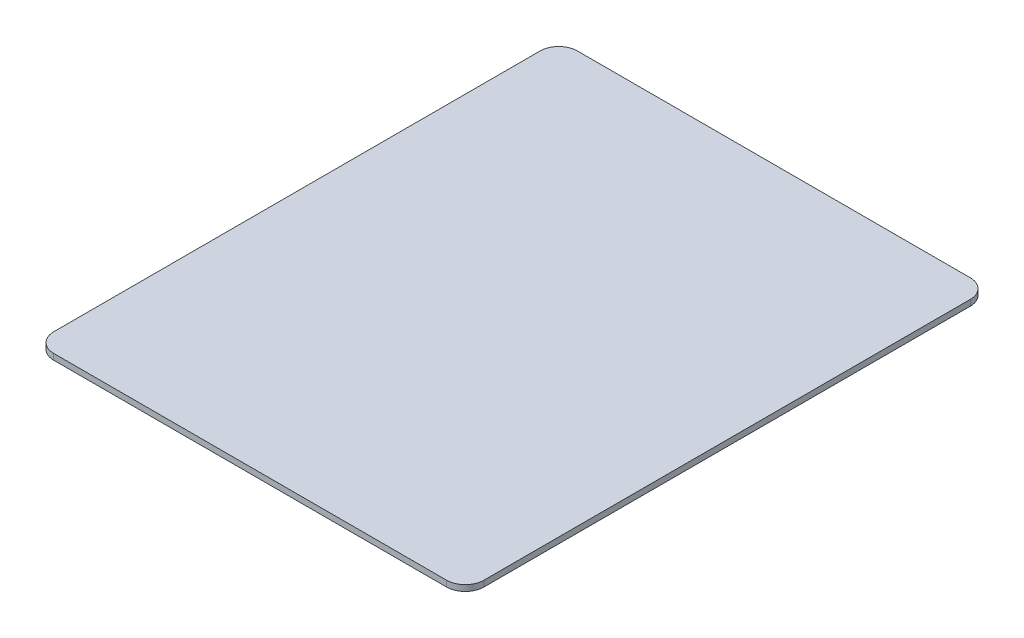
ISO-10303-21;
HEADER;
FILE_DESCRIPTION(('STEP AP214'),'2;1');
FILE_NAME('part.step','',(''),(''),'','','');
FILE_SCHEMA(('AUTOMOTIVE_DESIGN { 1 0 10303 214 1 1 1 1 }'));
ENDSEC;
DATA;
#1=APPLICATION_CONTEXT('core data for automotive mechanical design processes');
#2=APPLICATION_PROTOCOL_DEFINITION('international standard','automotive_design',2000,#1);
#3=PRODUCT_CONTEXT('',#1,'mechanical');
#4=PRODUCT('Part','Part','',(#3));
#5=PRODUCT_RELATED_PRODUCT_CATEGORY('part','',(#4));
#6=PRODUCT_DEFINITION_FORMATION('','',#4);
#7=PRODUCT_DEFINITION_CONTEXT('part definition',#1,'design');
#8=PRODUCT_DEFINITION('design','',#6,#7);
#9=PRODUCT_DEFINITION_SHAPE('','',#8);
#10=(LENGTH_UNIT() NAMED_UNIT(*) SI_UNIT(.MILLI.,.METRE.));
#11=(NAMED_UNIT(*) PLANE_ANGLE_UNIT() SI_UNIT($,.RADIAN.));
#12=(NAMED_UNIT(*) SI_UNIT($,.STERADIAN.) SOLID_ANGLE_UNIT());
#13=UNCERTAINTY_MEASURE_WITH_UNIT(LENGTH_MEASURE(1.E-05),#10,'distance_accuracy_value','');
#14=(GEOMETRIC_REPRESENTATION_CONTEXT(3) GLOBAL_UNCERTAINTY_ASSIGNED_CONTEXT((#13)) GLOBAL_UNIT_ASSIGNED_CONTEXT((#10,
#11,#12)) REPRESENTATION_CONTEXT('',''));
#15=CARTESIAN_POINT('',(0.,0.,0.));
#16=DIRECTION('',(0.,0.,1.));
#17=DIRECTION('',(1.,0.,0.));
#18=AXIS2_PLACEMENT_3D('',#15,#16,#17);
#19=CARTESIAN_POINT('',(115.,3.175,140.));
#20=DIRECTION('',(-1.,0.,0.));
#21=DIRECTION('',(0.,0.,1.));
#22=AXIS2_PLACEMENT_3D('',#19,#20,#21);
#23=PLANE('',#22);
#24=DIRECTION('',(0.,0.,-1.));
#25=VECTOR('',#24,1.);
#26=CARTESIAN_POINT('',(115.,0.,140.));
#27=LINE('',#26,#25);
#28=CARTESIAN_POINT('',(115.,0.,130.));
#29=VERTEX_POINT('',#28);
#30=CARTESIAN_POINT('',(115.,0.,-130.));
#31=VERTEX_POINT('',#30);
#32=EDGE_CURVE('E140',#29,#31,#27,.T.);
#33=ORIENTED_EDGE('',*,*,#32,.T.);
#34=DIRECTION('',(0.,-1.,0.));
#35=VECTOR('',#34,1.);
#36=CARTESIAN_POINT('',(115.,3.175,-130.));
#37=LINE('',#36,#35);
#38=CARTESIAN_POINT('',(115.,3.175,-130.));
#39=VERTEX_POINT('',#38);
#40=EDGE_CURVE('E174',#31,#39,#37,.F.);
#41=ORIENTED_EDGE('',*,*,#40,.T.);
#42=DIRECTION('',(0.,0.,-1.));
#43=VECTOR('',#42,1.);
#44=CARTESIAN_POINT('',(115.,3.175,140.));
#45=LINE('',#44,#43);
#46=CARTESIAN_POINT('',(115.,3.175,130.));
#47=VERTEX_POINT('',#46);
#48=EDGE_CURVE('E138',#47,#39,#45,.T.);
#49=ORIENTED_EDGE('',*,*,#48,.F.);
#50=DIRECTION('',(0.,-1.,0.));
#51=VECTOR('',#50,1.);
#52=CARTESIAN_POINT('',(115.,3.175,130.));
#53=LINE('',#52,#51);
#54=EDGE_CURVE('E170',#47,#29,#53,.T.);
#55=ORIENTED_EDGE('',*,*,#54,.T.);
#56=EDGE_LOOP('',(#33,#41,#49,#55));
#57=FACE_BOUND('',#56,.T.);
#58=ADVANCED_FACE('F39',(#57),#23,.F.);
#59=CARTESIAN_POINT('',(-115.,3.175,-140.));
#60=DIRECTION('',(0.,0.,1.));
#61=DIRECTION('',(1.,0.,0.));
#62=AXIS2_PLACEMENT_3D('',#59,#60,#61);
#63=PLANE('',#62);
#64=DIRECTION('',(-1.,0.,0.));
#65=VECTOR('',#64,1.);
#66=CARTESIAN_POINT('',(-115.,0.,-140.));
#67=LINE('',#66,#65);
#68=CARTESIAN_POINT('',(105.,0.,-140.));
#69=VERTEX_POINT('',#68);
#70=CARTESIAN_POINT('',(-105.,0.,-140.));
#71=VERTEX_POINT('',#70);
#72=EDGE_CURVE('E134',#69,#71,#67,.T.);
#73=ORIENTED_EDGE('',*,*,#72,.T.);
#74=DIRECTION('',(0.,-1.,0.));
#75=VECTOR('',#74,1.);
#76=CARTESIAN_POINT('',(-105.,3.175,-140.));
#77=LINE('',#76,#75);
#78=CARTESIAN_POINT('',(-105.,3.175,-140.));
#79=VERTEX_POINT('',#78);
#80=EDGE_CURVE('E110',#71,#79,#77,.F.);
#81=ORIENTED_EDGE('',*,*,#80,.T.);
#82=DIRECTION('',(-1.,0.,0.));
#83=VECTOR('',#82,1.);
#84=CARTESIAN_POINT('',(-115.,3.175,-140.));
#85=LINE('',#84,#83);
#86=CARTESIAN_POINT('',(105.,3.175,-140.));
#87=VERTEX_POINT('',#86);
#88=EDGE_CURVE('E193',#87,#79,#85,.T.);
#89=ORIENTED_EDGE('',*,*,#88,.F.);
#90=DIRECTION('',(0.,-1.,0.));
#91=VECTOR('',#90,1.);
#92=CARTESIAN_POINT('',(105.,3.175,-140.));
#93=LINE('',#92,#91);
#94=EDGE_CURVE('E116',#87,#69,#93,.T.);
#95=ORIENTED_EDGE('',*,*,#94,.T.);
#96=EDGE_LOOP('',(#73,#81,#89,#95));
#97=FACE_BOUND('',#96,.T.);
#98=ADVANCED_FACE('F214',(#97),#63,.F.);
#99=CARTESIAN_POINT('',(-115.,3.175,140.));
#100=DIRECTION('',(1.,0.,0.));
#101=DIRECTION('',(0.,0.,-1.));
#102=AXIS2_PLACEMENT_3D('',#99,#100,#101);
#103=PLANE('',#102);
#104=DIRECTION('',(0.,0.,1.));
#105=VECTOR('',#104,1.);
#106=CARTESIAN_POINT('',(-115.,3.175,140.));
#107=LINE('',#106,#105);
#108=CARTESIAN_POINT('',(-115.,3.175,-130.));
#109=VERTEX_POINT('',#108);
#110=CARTESIAN_POINT('',(-115.,3.175,130.));
#111=VERTEX_POINT('',#110);
#112=EDGE_CURVE('E125',#109,#111,#107,.T.);
#113=ORIENTED_EDGE('',*,*,#112,.F.);
#114=DIRECTION('',(0.,-1.,0.));
#115=VECTOR('',#114,1.);
#116=CARTESIAN_POINT('',(-115.,3.175,-130.));
#117=LINE('',#116,#115);
#118=CARTESIAN_POINT('',(-115.,0.,-130.));
#119=VERTEX_POINT('',#118);
#120=EDGE_CURVE('E109',#109,#119,#117,.T.);
#121=ORIENTED_EDGE('',*,*,#120,.T.);
#122=DIRECTION('',(0.,0.,1.));
#123=VECTOR('',#122,1.);
#124=CARTESIAN_POINT('',(-115.,0.,140.));
#125=LINE('',#124,#123);
#126=CARTESIAN_POINT('',(-115.,0.,130.));
#127=VERTEX_POINT('',#126);
#128=EDGE_CURVE('E123',#119,#127,#125,.T.);
#129=ORIENTED_EDGE('',*,*,#128,.T.);
#130=DIRECTION('',(0.,-1.,0.));
#131=VECTOR('',#130,1.);
#132=CARTESIAN_POINT('',(-115.,3.175,130.));
#133=LINE('',#132,#131);
#134=EDGE_CURVE('E128',#127,#111,#133,.F.);
#135=ORIENTED_EDGE('',*,*,#134,.T.);
#136=EDGE_LOOP('',(#113,#121,#129,#135));
#137=FACE_BOUND('',#136,.T.);
#138=ADVANCED_FACE('F122',(#137),#103,.F.);
#139=CARTESIAN_POINT('',(-115.,3.175,140.));
#140=DIRECTION('',(0.,0.,-1.));
#141=DIRECTION('',(-1.,0.,0.));
#142=AXIS2_PLACEMENT_3D('',#139,#140,#141);
#143=PLANE('',#142);
#144=DIRECTION('',(1.,0.,0.));
#145=VECTOR('',#144,1.);
#146=CARTESIAN_POINT('',(-115.,0.,140.));
#147=LINE('',#146,#145);
#148=CARTESIAN_POINT('',(-105.,0.,140.));
#149=VERTEX_POINT('',#148);
#150=CARTESIAN_POINT('',(105.,0.,140.));
#151=VERTEX_POINT('',#150);
#152=EDGE_CURVE('E133',#149,#151,#147,.T.);
#153=ORIENTED_EDGE('',*,*,#152,.T.);
#154=DIRECTION('',(0.,-1.,0.));
#155=VECTOR('',#154,1.);
#156=CARTESIAN_POINT('',(105.,3.175,140.));
#157=LINE('',#156,#155);
#158=CARTESIAN_POINT('',(105.,3.175,140.));
#159=VERTEX_POINT('',#158);
#160=EDGE_CURVE('E11',#151,#159,#157,.F.);
#161=ORIENTED_EDGE('',*,*,#160,.T.);
#162=DIRECTION('',(1.,0.,0.));
#163=VECTOR('',#162,1.);
#164=CARTESIAN_POINT('',(-115.,3.175,140.));
#165=LINE('',#164,#163);
#166=CARTESIAN_POINT('',(-105.,3.175,140.));
#167=VERTEX_POINT('',#166);
#168=EDGE_CURVE('E145',#167,#159,#165,.T.);
#169=ORIENTED_EDGE('',*,*,#168,.F.);
#170=DIRECTION('',(0.,-1.,0.));
#171=VECTOR('',#170,1.);
#172=CARTESIAN_POINT('',(-105.,3.175,140.));
#173=LINE('',#172,#171);
#174=EDGE_CURVE('E48',#167,#149,#173,.T.);
#175=ORIENTED_EDGE('',*,*,#174,.T.);
#176=EDGE_LOOP('',(#153,#161,#169,#175));
#177=FACE_BOUND('',#176,.T.);
#178=ADVANCED_FACE('F179',(#177),#143,.F.);
#179=CARTESIAN_POINT('',(0.,3.175,0.));
#180=DIRECTION('',(0.,-1.,0.));
#181=DIRECTION('',(0.,0.,-1.));
#182=AXIS2_PLACEMENT_3D('',#179,#180,#181);
#183=PLANE('',#182);
#184=ORIENTED_EDGE('',*,*,#88,.T.);
#185=CARTESIAN_POINT('',(-105.,3.175,-130.));
#186=DIRECTION('',(0.,-1.,0.));
#187=DIRECTION('',(0.,0.,-1.));
#188=AXIS2_PLACEMENT_3D('',#185,#186,#187);
#189=CIRCLE('',#188,10.);
#190=EDGE_CURVE('E167',#79,#109,#189,.F.);
#191=ORIENTED_EDGE('',*,*,#190,.T.);
#192=ORIENTED_EDGE('',*,*,#112,.T.);
#193=CARTESIAN_POINT('',(-105.,3.175,130.));
#194=DIRECTION('',(0.,-1.,0.));
#195=DIRECTION('',(0.,0.,-1.));
#196=AXIS2_PLACEMENT_3D('',#193,#194,#195);
#197=CIRCLE('',#196,10.);
#198=EDGE_CURVE('E60',#111,#167,#197,.F.);
#199=ORIENTED_EDGE('',*,*,#198,.T.);
#200=ORIENTED_EDGE('',*,*,#168,.T.);
#201=CARTESIAN_POINT('',(105.,3.175,130.));
#202=DIRECTION('',(0.,-1.,0.));
#203=DIRECTION('',(0.,0.,-1.));
#204=AXIS2_PLACEMENT_3D('',#201,#202,#203);
#205=CIRCLE('',#204,10.);
#206=EDGE_CURVE('E161',#159,#47,#205,.F.);
#207=ORIENTED_EDGE('',*,*,#206,.T.);
#208=ORIENTED_EDGE('',*,*,#48,.T.);
#209=CARTESIAN_POINT('',(105.,3.175,-130.));
#210=DIRECTION('',(0.,-1.,0.));
#211=DIRECTION('',(0.,0.,-1.));
#212=AXIS2_PLACEMENT_3D('',#209,#210,#211);
#213=CIRCLE('',#212,10.);
#214=EDGE_CURVE('E164',#39,#87,#213,.F.);
#215=ORIENTED_EDGE('',*,*,#214,.T.);
#216=EDGE_LOOP('',(#184,#191,#192,#199,#200,#207,#208,#215));
#217=FACE_BOUND('',#216,.T.);
#218=ADVANCED_FACE('F203',(#217),#183,.F.);
#219=CARTESIAN_POINT('',(0.,0.,0.));
#220=DIRECTION('',(0.,-1.,0.));
#221=DIRECTION('',(0.,0.,-1.));
#222=AXIS2_PLACEMENT_3D('',#219,#220,#221);
#223=PLANE('',#222);
#224=ORIENTED_EDGE('',*,*,#128,.F.);
#225=CARTESIAN_POINT('',(-105.,0.,-130.));
#226=DIRECTION('',(0.,-1.,0.));
#227=DIRECTION('',(0.,0.,-1.));
#228=AXIS2_PLACEMENT_3D('',#225,#226,#227);
#229=CIRCLE('',#228,10.);
#230=EDGE_CURVE('E105',#119,#71,#229,.T.);
#231=ORIENTED_EDGE('',*,*,#230,.T.);
#232=ORIENTED_EDGE('',*,*,#72,.F.);
#233=CARTESIAN_POINT('',(105.,0.,-130.));
#234=DIRECTION('',(0.,-1.,0.));
#235=DIRECTION('',(0.,0.,-1.));
#236=AXIS2_PLACEMENT_3D('',#233,#234,#235);
#237=CIRCLE('',#236,10.);
#238=EDGE_CURVE('E117',#69,#31,#237,.T.);
#239=ORIENTED_EDGE('',*,*,#238,.T.);
#240=ORIENTED_EDGE('',*,*,#32,.F.);
#241=CARTESIAN_POINT('',(105.,0.,130.));
#242=DIRECTION('',(0.,-1.,0.));
#243=DIRECTION('',(0.,0.,-1.));
#244=AXIS2_PLACEMENT_3D('',#241,#242,#243);
#245=CIRCLE('',#244,10.);
#246=EDGE_CURVE('E149',#29,#151,#245,.T.);
#247=ORIENTED_EDGE('',*,*,#246,.T.);
#248=ORIENTED_EDGE('',*,*,#152,.F.);
#249=CARTESIAN_POINT('',(-105.,0.,130.));
#250=DIRECTION('',(0.,-1.,0.));
#251=DIRECTION('',(0.,0.,-1.));
#252=AXIS2_PLACEMENT_3D('',#249,#250,#251);
#253=CIRCLE('',#252,10.);
#254=EDGE_CURVE('E127',#149,#127,#253,.T.);
#255=ORIENTED_EDGE('',*,*,#254,.T.);
#256=EDGE_LOOP('',(#224,#231,#232,#239,#240,#247,#248,#255));
#257=FACE_BOUND('',#256,.T.);
#258=ADVANCED_FACE('F130',(#257),#223,.T.);
#259=CARTESIAN_POINT('',(-105.,3.175,-130.));
#260=DIRECTION('',(0.,-1.,0.));
#261=DIRECTION('',(0.,0.,-1.));
#262=AXIS2_PLACEMENT_3D('',#259,#260,#261);
#263=CYLINDRICAL_SURFACE('',#262,10.);
#264=ORIENTED_EDGE('',*,*,#190,.F.);
#265=ORIENTED_EDGE('',*,*,#80,.F.);
#266=ORIENTED_EDGE('',*,*,#230,.F.);
#267=ORIENTED_EDGE('',*,*,#120,.F.);
#268=EDGE_LOOP('',(#264,#265,#266,#267));
#269=FACE_BOUND('',#268,.T.);
#270=ADVANCED_FACE('F108',(#269),#263,.T.);
#271=CARTESIAN_POINT('',(105.,3.175,-130.));
#272=DIRECTION('',(0.,-1.,0.));
#273=DIRECTION('',(0.,0.,-1.));
#274=AXIS2_PLACEMENT_3D('',#271,#272,#273);
#275=CYLINDRICAL_SURFACE('',#274,10.);
#276=ORIENTED_EDGE('',*,*,#214,.F.);
#277=ORIENTED_EDGE('',*,*,#40,.F.);
#278=ORIENTED_EDGE('',*,*,#238,.F.);
#279=ORIENTED_EDGE('',*,*,#94,.F.);
#280=EDGE_LOOP('',(#276,#277,#278,#279));
#281=FACE_BOUND('',#280,.T.);
#282=ADVANCED_FACE('F225',(#281),#275,.T.);
#283=CARTESIAN_POINT('',(105.,3.175,130.));
#284=DIRECTION('',(0.,-1.,0.));
#285=DIRECTION('',(0.,0.,-1.));
#286=AXIS2_PLACEMENT_3D('',#283,#284,#285);
#287=CYLINDRICAL_SURFACE('',#286,10.);
#288=ORIENTED_EDGE('',*,*,#206,.F.);
#289=ORIENTED_EDGE('',*,*,#160,.F.);
#290=ORIENTED_EDGE('',*,*,#246,.F.);
#291=ORIENTED_EDGE('',*,*,#54,.F.);
#292=EDGE_LOOP('',(#288,#289,#290,#291));
#293=FACE_BOUND('',#292,.T.);
#294=ADVANCED_FACE('F186',(#293),#287,.T.);
#295=CARTESIAN_POINT('',(-105.,3.175,130.));
#296=DIRECTION('',(0.,-1.,0.));
#297=DIRECTION('',(0.,0.,-1.));
#298=AXIS2_PLACEMENT_3D('',#295,#296,#297);
#299=CYLINDRICAL_SURFACE('',#298,10.);
#300=ORIENTED_EDGE('',*,*,#198,.F.);
#301=ORIENTED_EDGE('',*,*,#134,.F.);
#302=ORIENTED_EDGE('',*,*,#254,.F.);
#303=ORIENTED_EDGE('',*,*,#174,.F.);
#304=EDGE_LOOP('',(#300,#301,#302,#303));
#305=FACE_BOUND('',#304,.T.);
#306=ADVANCED_FACE('F41',(#305),#299,.T.);
#307=CLOSED_SHELL('',(#58,#98,#138,#178,#218,#258,#270,#282,#294,#306));
#308=MANIFOLD_SOLID_BREP('B2',#307);
#309=ADVANCED_BREP_SHAPE_REPRESENTATION('',(#18,#308),#14);
#310=SHAPE_DEFINITION_REPRESENTATION(#9,#309);
ENDSEC;
END-ISO-10303-21;
